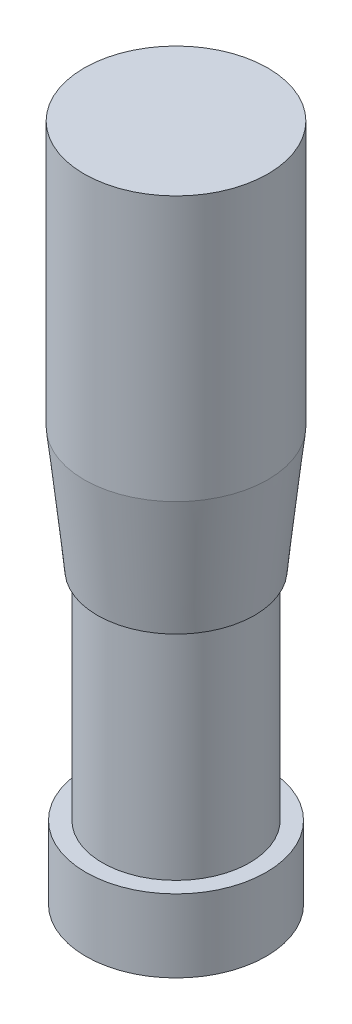
ISO-10303-21;
HEADER;
FILE_DESCRIPTION(('STEP AP214'),'2;1');
FILE_NAME('part.step','',(''),(''),'','','');
FILE_SCHEMA(('AUTOMOTIVE_DESIGN { 1 0 10303 214 1 1 1 1 }'));
ENDSEC;
DATA;
#1=APPLICATION_CONTEXT('core data for automotive mechanical design processes');
#2=APPLICATION_PROTOCOL_DEFINITION('international standard','automotive_design',2000,#1);
#3=PRODUCT_CONTEXT('',#1,'mechanical');
#4=PRODUCT('Part','Part','',(#3));
#5=PRODUCT_RELATED_PRODUCT_CATEGORY('part','',(#4));
#6=PRODUCT_DEFINITION_FORMATION('','',#4);
#7=PRODUCT_DEFINITION_CONTEXT('part definition',#1,'design');
#8=PRODUCT_DEFINITION('design','',#6,#7);
#9=PRODUCT_DEFINITION_SHAPE('','',#8);
#10=(LENGTH_UNIT() NAMED_UNIT(*) SI_UNIT(.MILLI.,.METRE.));
#11=(NAMED_UNIT(*) PLANE_ANGLE_UNIT() SI_UNIT($,.RADIAN.));
#12=(NAMED_UNIT(*) SI_UNIT($,.STERADIAN.) SOLID_ANGLE_UNIT());
#13=UNCERTAINTY_MEASURE_WITH_UNIT(LENGTH_MEASURE(1.E-05),#10,'distance_accuracy_value','');
#14=(GEOMETRIC_REPRESENTATION_CONTEXT(3) GLOBAL_UNCERTAINTY_ASSIGNED_CONTEXT((#13)) GLOBAL_UNIT_ASSIGNED_CONTEXT((#10,
#11,#12)) REPRESENTATION_CONTEXT('',''));
#15=CARTESIAN_POINT('',(0.,0.,0.));
#16=DIRECTION('',(0.,0.,1.));
#17=DIRECTION('',(1.,0.,0.));
#18=AXIS2_PLACEMENT_3D('',#15,#16,#17);
#19=CARTESIAN_POINT('',(0.,0.,0.));
#20=DIRECTION('',(0.,1.,0.));
#21=DIRECTION('',(0.,0.,1.));
#22=AXIS2_PLACEMENT_3D('',#19,#20,#21);
#23=PLANE('',#22);
#24=CARTESIAN_POINT('',(0.,0.,0.));
#25=DIRECTION('',(0.,-1.,0.));
#26=DIRECTION('',(0.,0.,-1.));
#27=AXIS2_PLACEMENT_3D('',#24,#25,#26);
#28=CIRCLE('',#27,5.45);
#29=CARTESIAN_POINT('',(0.,0.,-5.45));
#30=VERTEX_POINT('',#29);
#31=EDGE_CURVE('E10',#30,#30,#28,.T.);
#32=ORIENTED_EDGE('',*,*,#31,.T.);
#33=EDGE_LOOP('',(#32));
#34=FACE_BOUND('',#33,.T.);
#35=ADVANCED_FACE('F34',(#34),#23,.F.);
#36=CARTESIAN_POINT('',(0.,0.,0.));
#37=DIRECTION('',(0.,-1.,0.));
#38=DIRECTION('',(0.,0.,-1.));
#39=AXIS2_PLACEMENT_3D('',#36,#37,#38);
#40=CYLINDRICAL_SURFACE('',#39,5.45);
#41=ORIENTED_EDGE('',*,*,#31,.F.);
#42=EDGE_LOOP('',(#41));
#43=FACE_BOUND('',#42,.T.);
#44=CARTESIAN_POINT('',(0.,4.4,0.));
#45=DIRECTION('',(0.,-1.,0.));
#46=DIRECTION('',(0.,0.,-1.));
#47=AXIS2_PLACEMENT_3D('',#44,#45,#46);
#48=CIRCLE('',#47,5.45);
#49=CARTESIAN_POINT('',(0.,4.4,-5.45));
#50=VERTEX_POINT('',#49);
#51=EDGE_CURVE('E40',#50,#50,#48,.T.);
#52=ORIENTED_EDGE('',*,*,#51,.T.);
#53=EDGE_LOOP('',(#52));
#54=FACE_BOUND('',#53,.T.);
#55=ADVANCED_FACE('F75',(#43,#54),#40,.T.);
#56=CARTESIAN_POINT('',(-5.45,4.4,0.));
#57=DIRECTION('',(0.,-1.,0.));
#58=DIRECTION('',(0.,0.,-1.));
#59=AXIS2_PLACEMENT_3D('',#56,#57,#58);
#60=PLANE('',#59);
#61=ORIENTED_EDGE('',*,*,#51,.F.);
#62=EDGE_LOOP('',(#61));
#63=FACE_BOUND('',#62,.T.);
#64=CARTESIAN_POINT('',(0.,4.4,0.));
#65=DIRECTION('',(0.,-1.,0.));
#66=DIRECTION('',(0.,0.,-1.));
#67=AXIS2_PLACEMENT_3D('',#64,#65,#66);
#68=CIRCLE('',#67,4.45);
#69=CARTESIAN_POINT('',(0.,4.4,-4.45));
#70=VERTEX_POINT('',#69);
#71=EDGE_CURVE('E44',#70,#70,#68,.T.);
#72=ORIENTED_EDGE('',*,*,#71,.T.);
#73=EDGE_LOOP('',(#72));
#74=FACE_BOUND('',#73,.T.);
#75=ADVANCED_FACE('F79',(#63,#74),#60,.F.);
#76=CARTESIAN_POINT('',(0.,0.,0.));
#77=DIRECTION('',(0.,-1.,0.));
#78=DIRECTION('',(0.,0.,-1.));
#79=AXIS2_PLACEMENT_3D('',#76,#77,#78);
#80=CYLINDRICAL_SURFACE('',#79,4.45);
#81=ORIENTED_EDGE('',*,*,#71,.F.);
#82=EDGE_LOOP('',(#81));
#83=FACE_BOUND('',#82,.T.);
#84=CARTESIAN_POINT('',(0.,17.5,0.));
#85=DIRECTION('',(0.,-1.,0.));
#86=DIRECTION('',(0.,0.,-1.));
#87=AXIS2_PLACEMENT_3D('',#84,#85,#86);
#88=CIRCLE('',#87,4.45);
#89=CARTESIAN_POINT('',(0.,17.5,-4.45));
#90=VERTEX_POINT('',#89);
#91=EDGE_CURVE('E48',#90,#90,#88,.T.);
#92=ORIENTED_EDGE('',*,*,#91,.T.);
#93=EDGE_LOOP('',(#92));
#94=FACE_BOUND('',#93,.T.);
#95=ADVANCED_FACE('F84',(#83,#94),#80,.T.);
#96=CARTESIAN_POINT('',(-4.45,17.5,0.));
#97=DIRECTION('',(0.,1.,0.));
#98=DIRECTION('',(0.,0.,1.));
#99=AXIS2_PLACEMENT_3D('',#96,#97,#98);
#100=PLANE('',#99);
#101=ORIENTED_EDGE('',*,*,#91,.F.);
#102=EDGE_LOOP('',(#101));
#103=FACE_BOUND('',#102,.T.);
#104=CARTESIAN_POINT('',(0.,17.5,0.));
#105=DIRECTION('',(0.,-1.,0.));
#106=DIRECTION('',(0.,0.,-1.));
#107=AXIS2_PLACEMENT_3D('',#104,#105,#106);
#108=CIRCLE('',#107,4.75);
#109=CARTESIAN_POINT('',(0.,17.5,-4.75));
#110=VERTEX_POINT('',#109);
#111=EDGE_CURVE('E53',#110,#110,#108,.T.);
#112=ORIENTED_EDGE('',*,*,#111,.T.);
#113=EDGE_LOOP('',(#112));
#114=FACE_BOUND('',#113,.T.);
#115=ADVANCED_FACE('F90',(#103,#114),#100,.F.);
#116=CARTESIAN_POINT('',(0.,25.,0.));
#117=DIRECTION('',(0.,1.,0.));
#118=DIRECTION('',(0.,0.,1.));
#119=AXIS2_PLACEMENT_3D('',#116,#117,#118);
#120=CONICAL_SURFACE('',#119,5.55,0.106264862891079);
#121=ORIENTED_EDGE('',*,*,#111,.F.);
#122=EDGE_LOOP('',(#121));
#123=FACE_BOUND('',#122,.T.);
#124=CARTESIAN_POINT('',(0.,25.,0.));
#125=DIRECTION('',(0.,-1.,0.));
#126=DIRECTION('',(0.,0.,-1.));
#127=AXIS2_PLACEMENT_3D('',#124,#125,#126);
#128=CIRCLE('',#127,5.55);
#129=CARTESIAN_POINT('',(0.,25.,-5.55));
#130=VERTEX_POINT('',#129);
#131=EDGE_CURVE('E56',#130,#130,#128,.T.);
#132=ORIENTED_EDGE('',*,*,#131,.T.);
#133=EDGE_LOOP('',(#132));
#134=FACE_BOUND('',#133,.T.);
#135=ADVANCED_FACE('F71',(#123,#134),#120,.T.);
#136=CARTESIAN_POINT('',(0.,0.,0.));
#137=DIRECTION('',(0.,-1.,0.));
#138=DIRECTION('',(0.,0.,-1.));
#139=AXIS2_PLACEMENT_3D('',#136,#137,#138);
#140=CYLINDRICAL_SURFACE('',#139,5.55);
#141=ORIENTED_EDGE('',*,*,#131,.F.);
#142=EDGE_LOOP('',(#141));
#143=FACE_BOUND('',#142,.T.);
#144=CARTESIAN_POINT('',(0.,41.,0.));
#145=DIRECTION('',(0.,-1.,0.));
#146=DIRECTION('',(0.,0.,-1.));
#147=AXIS2_PLACEMENT_3D('',#144,#145,#146);
#148=CIRCLE('',#147,5.55);
#149=CARTESIAN_POINT('',(0.,41.,-5.55));
#150=VERTEX_POINT('',#149);
#151=EDGE_CURVE('E59',#150,#150,#148,.T.);
#152=ORIENTED_EDGE('',*,*,#151,.T.);
#153=EDGE_LOOP('',(#152));
#154=FACE_BOUND('',#153,.T.);
#155=ADVANCED_FACE('F63',(#143,#154),#140,.T.);
#156=CARTESIAN_POINT('',(-5.55,41.,0.));
#157=DIRECTION('',(0.,-1.,0.));
#158=DIRECTION('',(0.,0.,-1.));
#159=AXIS2_PLACEMENT_3D('',#156,#157,#158);
#160=PLANE('',#159);
#161=ORIENTED_EDGE('',*,*,#151,.F.);
#162=EDGE_LOOP('',(#161));
#163=FACE_BOUND('',#162,.T.);
#164=ADVANCED_FACE('F65',(#163),#160,.F.);
#165=CLOSED_SHELL('',(#35,#55,#75,#95,#115,#135,#155,#164));
#166=MANIFOLD_SOLID_BREP('B2',#165);
#167=ADVANCED_BREP_SHAPE_REPRESENTATION('',(#18,#166),#14);
#168=SHAPE_DEFINITION_REPRESENTATION(#9,#167);
ENDSEC;
END-ISO-10303-21;
